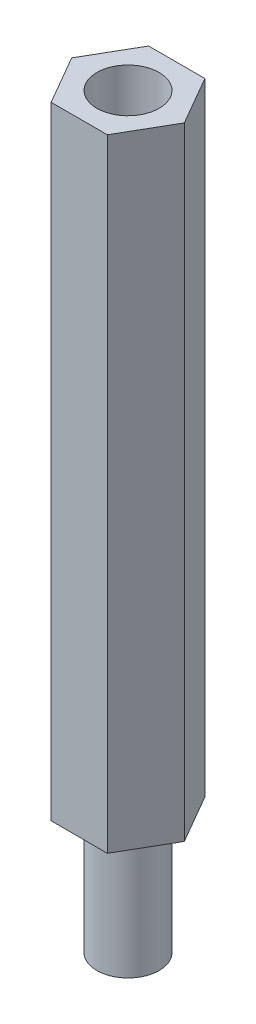
ISO-10303-21;
HEADER;
FILE_DESCRIPTION(('STEP AP214'),'2;1');
FILE_NAME('part.step','',(''),(''),'','','');
FILE_SCHEMA(('AUTOMOTIVE_DESIGN { 1 0 10303 214 1 1 1 1 }'));
ENDSEC;
DATA;
#1=APPLICATION_CONTEXT('core data for automotive mechanical design processes');
#2=APPLICATION_PROTOCOL_DEFINITION('international standard','automotive_design',2000,#1);
#3=PRODUCT_CONTEXT('',#1,'mechanical');
#4=PRODUCT('Part','Part','',(#3));
#5=PRODUCT_RELATED_PRODUCT_CATEGORY('part','',(#4));
#6=PRODUCT_DEFINITION_FORMATION('','',#4);
#7=PRODUCT_DEFINITION_CONTEXT('part definition',#1,'design');
#8=PRODUCT_DEFINITION('design','',#6,#7);
#9=PRODUCT_DEFINITION_SHAPE('','',#8);
#10=(LENGTH_UNIT() NAMED_UNIT(*) SI_UNIT(.MILLI.,.METRE.));
#11=(NAMED_UNIT(*) PLANE_ANGLE_UNIT() SI_UNIT($,.RADIAN.));
#12=(NAMED_UNIT(*) SI_UNIT($,.STERADIAN.) SOLID_ANGLE_UNIT());
#13=UNCERTAINTY_MEASURE_WITH_UNIT(LENGTH_MEASURE(1.E-05),#10,'distance_accuracy_value','');
#14=(GEOMETRIC_REPRESENTATION_CONTEXT(3) GLOBAL_UNCERTAINTY_ASSIGNED_CONTEXT((#13)) GLOBAL_UNIT_ASSIGNED_CONTEXT((#10,
#11,#12)) REPRESENTATION_CONTEXT('',''));
#15=CARTESIAN_POINT('',(0.,0.,0.));
#16=DIRECTION('',(0.,0.,1.));
#17=DIRECTION('',(1.,0.,0.));
#18=AXIS2_PLACEMENT_3D('',#15,#16,#17);
#19=CARTESIAN_POINT('',(-1.35677313259562,30.,2.35));
#20=DIRECTION('',(0.,0.,-1.));
#21=DIRECTION('',(-1.,0.,0.));
#22=AXIS2_PLACEMENT_3D('',#19,#20,#21);
#23=PLANE('',#22);
#24=DIRECTION('',(1.,0.,0.));
#25=VECTOR('',#24,1.);
#26=CARTESIAN_POINT('',(-1.35677313259562,0.,2.35));
#27=LINE('',#26,#25);
#28=CARTESIAN_POINT('',(-1.35677313259562,0.,2.35));
#29=VERTEX_POINT('',#28);
#30=CARTESIAN_POINT('',(1.35677313259562,0.,2.35));
#31=VERTEX_POINT('',#30);
#32=EDGE_CURVE('E122',#29,#31,#27,.T.);
#33=ORIENTED_EDGE('',*,*,#32,.T.);
#34=DIRECTION('',(0.,-1.,0.));
#35=VECTOR('',#34,1.);
#36=CARTESIAN_POINT('',(1.35677313259562,30.,2.35));
#37=LINE('',#36,#35);
#38=CARTESIAN_POINT('',(1.35677313259562,30.,2.35));
#39=VERTEX_POINT('',#38);
#40=EDGE_CURVE('E45',#39,#31,#37,.T.);
#41=ORIENTED_EDGE('',*,*,#40,.F.);
#42=DIRECTION('',(1.,0.,0.));
#43=VECTOR('',#42,1.);
#44=CARTESIAN_POINT('',(-1.35677313259562,30.,2.35));
#45=LINE('',#44,#43);
#46=CARTESIAN_POINT('',(-1.35677313259562,30.,2.35));
#47=VERTEX_POINT('',#46);
#48=EDGE_CURVE('E133',#47,#39,#45,.T.);
#49=ORIENTED_EDGE('',*,*,#48,.F.);
#50=DIRECTION('',(0.,-1.,0.));
#51=VECTOR('',#50,1.);
#52=CARTESIAN_POINT('',(-1.35677313259562,30.,2.35));
#53=LINE('',#52,#51);
#54=EDGE_CURVE('E118',#47,#29,#53,.T.);
#55=ORIENTED_EDGE('',*,*,#54,.T.);
#56=EDGE_LOOP('',(#33,#41,#49,#55));
#57=FACE_BOUND('',#56,.T.);
#58=ADVANCED_FACE('F37',(#57),#23,.F.);
#59=CARTESIAN_POINT('',(1.35677313259562,30.,2.35));
#60=DIRECTION('',(-0.866025403784439,0.,-0.5));
#61=DIRECTION('',(-0.5,0.,0.866025403784439));
#62=AXIS2_PLACEMENT_3D('',#59,#60,#61);
#63=PLANE('',#62);
#64=DIRECTION('',(0.5,0.,-0.866025403784439));
#65=VECTOR('',#64,1.);
#66=CARTESIAN_POINT('',(1.35677313259562,0.,2.35));
#67=LINE('',#66,#65);
#68=CARTESIAN_POINT('',(2.71354626519124,0.,0.));
#69=VERTEX_POINT('',#68);
#70=EDGE_CURVE('E125',#31,#69,#67,.T.);
#71=ORIENTED_EDGE('',*,*,#70,.T.);
#72=DIRECTION('',(0.,-1.,0.));
#73=VECTOR('',#72,1.);
#74=CARTESIAN_POINT('',(2.71354626519124,30.,0.));
#75=LINE('',#74,#73);
#76=CARTESIAN_POINT('',(2.71354626519124,30.,0.));
#77=VERTEX_POINT('',#76);
#78=EDGE_CURVE('E137',#77,#69,#75,.T.);
#79=ORIENTED_EDGE('',*,*,#78,.F.);
#80=DIRECTION('',(0.5,0.,-0.866025403784439));
#81=VECTOR('',#80,1.);
#82=CARTESIAN_POINT('',(1.35677313259562,30.,2.35));
#83=LINE('',#82,#81);
#84=EDGE_CURVE('E91',#39,#77,#83,.T.);
#85=ORIENTED_EDGE('',*,*,#84,.F.);
#86=ORIENTED_EDGE('',*,*,#40,.T.);
#87=EDGE_LOOP('',(#71,#79,#85,#86));
#88=FACE_BOUND('',#87,.T.);
#89=ADVANCED_FACE('F140',(#88),#63,.F.);
#90=CARTESIAN_POINT('',(2.71354626519124,30.,0.));
#91=DIRECTION('',(-0.866025403784439,0.,0.5));
#92=DIRECTION('',(0.5,0.,0.866025403784439));
#93=AXIS2_PLACEMENT_3D('',#90,#91,#92);
#94=PLANE('',#93);
#95=DIRECTION('',(-0.5,0.,-0.866025403784439));
#96=VECTOR('',#95,1.);
#97=CARTESIAN_POINT('',(2.71354626519124,0.,0.));
#98=LINE('',#97,#96);
#99=CARTESIAN_POINT('',(1.35677313259562,0.,-2.35));
#100=VERTEX_POINT('',#99);
#101=EDGE_CURVE('E128',#69,#100,#98,.T.);
#102=ORIENTED_EDGE('',*,*,#101,.T.);
#103=DIRECTION('',(0.,-1.,0.));
#104=VECTOR('',#103,1.);
#105=CARTESIAN_POINT('',(1.35677313259562,30.,-2.35));
#106=LINE('',#105,#104);
#107=CARTESIAN_POINT('',(1.35677313259562,30.,-2.35));
#108=VERTEX_POINT('',#107);
#109=EDGE_CURVE('E113',#108,#100,#106,.T.);
#110=ORIENTED_EDGE('',*,*,#109,.F.);
#111=DIRECTION('',(-0.5,0.,-0.866025403784439));
#112=VECTOR('',#111,1.);
#113=CARTESIAN_POINT('',(2.71354626519124,30.,0.));
#114=LINE('',#113,#112);
#115=EDGE_CURVE('E104',#77,#108,#114,.T.);
#116=ORIENTED_EDGE('',*,*,#115,.F.);
#117=ORIENTED_EDGE('',*,*,#78,.T.);
#118=EDGE_LOOP('',(#102,#110,#116,#117));
#119=FACE_BOUND('',#118,.T.);
#120=ADVANCED_FACE('F148',(#119),#94,.F.);
#121=CARTESIAN_POINT('',(1.35677313259562,30.,-2.35));
#122=DIRECTION('',(0.,0.,1.));
#123=DIRECTION('',(1.,0.,0.));
#124=AXIS2_PLACEMENT_3D('',#121,#122,#123);
#125=PLANE('',#124);
#126=DIRECTION('',(-1.,0.,0.));
#127=VECTOR('',#126,1.);
#128=CARTESIAN_POINT('',(1.35677313259562,0.,-2.35));
#129=LINE('',#128,#127);
#130=CARTESIAN_POINT('',(-1.35677313259562,0.,-2.35));
#131=VERTEX_POINT('',#130);
#132=EDGE_CURVE('E112',#100,#131,#129,.T.);
#133=ORIENTED_EDGE('',*,*,#132,.T.);
#134=DIRECTION('',(0.,-1.,0.));
#135=VECTOR('',#134,1.);
#136=CARTESIAN_POINT('',(-1.35677313259562,30.,-2.35));
#137=LINE('',#136,#135);
#138=CARTESIAN_POINT('',(-1.35677313259562,30.,-2.35));
#139=VERTEX_POINT('',#138);
#140=EDGE_CURVE('E109',#139,#131,#137,.T.);
#141=ORIENTED_EDGE('',*,*,#140,.F.);
#142=DIRECTION('',(-1.,0.,0.));
#143=VECTOR('',#142,1.);
#144=CARTESIAN_POINT('',(1.35677313259562,30.,-2.35));
#145=LINE('',#144,#143);
#146=EDGE_CURVE('E98',#108,#139,#145,.T.);
#147=ORIENTED_EDGE('',*,*,#146,.F.);
#148=ORIENTED_EDGE('',*,*,#109,.T.);
#149=EDGE_LOOP('',(#133,#141,#147,#148));
#150=FACE_BOUND('',#149,.T.);
#151=ADVANCED_FACE('F110',(#150),#125,.F.);
#152=CARTESIAN_POINT('',(-1.35677313259562,30.,-2.35));
#153=DIRECTION('',(0.866025403784439,0.,0.5));
#154=DIRECTION('',(0.5,0.,-0.866025403784439));
#155=AXIS2_PLACEMENT_3D('',#152,#153,#154);
#156=PLANE('',#155);
#157=DIRECTION('',(-0.5,0.,0.866025403784439));
#158=VECTOR('',#157,1.);
#159=CARTESIAN_POINT('',(-1.35677313259562,0.,-2.35));
#160=LINE('',#159,#158);
#161=CARTESIAN_POINT('',(-2.71354626519124,0.,0.));
#162=VERTEX_POINT('',#161);
#163=EDGE_CURVE('E76',#131,#162,#160,.T.);
#164=ORIENTED_EDGE('',*,*,#163,.T.);
#165=DIRECTION('',(0.,-1.,0.));
#166=VECTOR('',#165,1.);
#167=CARTESIAN_POINT('',(-2.71354626519124,30.,0.));
#168=LINE('',#167,#166);
#169=CARTESIAN_POINT('',(-2.71354626519124,30.,0.));
#170=VERTEX_POINT('',#169);
#171=EDGE_CURVE('E114',#170,#162,#168,.T.);
#172=ORIENTED_EDGE('',*,*,#171,.F.);
#173=DIRECTION('',(-0.5,0.,0.866025403784439));
#174=VECTOR('',#173,1.);
#175=CARTESIAN_POINT('',(-1.35677313259562,30.,-2.35));
#176=LINE('',#175,#174);
#177=EDGE_CURVE('E102',#139,#170,#176,.T.);
#178=ORIENTED_EDGE('',*,*,#177,.F.);
#179=ORIENTED_EDGE('',*,*,#140,.T.);
#180=EDGE_LOOP('',(#164,#172,#178,#179));
#181=FACE_BOUND('',#180,.T.);
#182=ADVANCED_FACE('F116',(#181),#156,.F.);
#183=CARTESIAN_POINT('',(-2.71354626519124,30.,0.));
#184=DIRECTION('',(0.866025403784439,0.,-0.5));
#185=DIRECTION('',(-0.5,0.,-0.866025403784439));
#186=AXIS2_PLACEMENT_3D('',#183,#184,#185);
#187=PLANE('',#186);
#188=DIRECTION('',(0.5,0.,0.866025403784439));
#189=VECTOR('',#188,1.);
#190=CARTESIAN_POINT('',(-2.71354626519124,0.,0.));
#191=LINE('',#190,#189);
#192=EDGE_CURVE('E82',#162,#29,#191,.T.);
#193=ORIENTED_EDGE('',*,*,#192,.T.);
#194=ORIENTED_EDGE('',*,*,#54,.F.);
#195=DIRECTION('',(0.5,0.,0.866025403784439));
#196=VECTOR('',#195,1.);
#197=CARTESIAN_POINT('',(-2.71354626519124,30.,0.));
#198=LINE('',#197,#196);
#199=EDGE_CURVE('E53',#170,#47,#198,.T.);
#200=ORIENTED_EDGE('',*,*,#199,.F.);
#201=ORIENTED_EDGE('',*,*,#171,.T.);
#202=EDGE_LOOP('',(#193,#194,#200,#201));
#203=FACE_BOUND('',#202,.T.);
#204=ADVANCED_FACE('F164',(#203),#187,.F.);
#205=CARTESIAN_POINT('',(0.,30.,0.));
#206=DIRECTION('',(0.,1.,0.));
#207=DIRECTION('',(0.,0.,1.));
#208=AXIS2_PLACEMENT_3D('',#205,#206,#207);
#209=PLANE('',#208);
#210=CARTESIAN_POINT('',(0.,30.,0.));
#211=DIRECTION('',(0.,1.,0.));
#212=DIRECTION('',(0.,0.,1.));
#213=AXIS2_PLACEMENT_3D('',#210,#211,#212);
#214=CIRCLE('',#213,1.5);
#215=CARTESIAN_POINT('',(0.,30.,1.5));
#216=VERTEX_POINT('',#215);
#217=EDGE_CURVE('E157',#216,#216,#214,.T.);
#218=ORIENTED_EDGE('',*,*,#217,.F.);
#219=EDGE_LOOP('',(#218));
#220=FACE_BOUND('',#219,.T.);
#221=ORIENTED_EDGE('',*,*,#48,.T.);
#222=ORIENTED_EDGE('',*,*,#84,.T.);
#223=ORIENTED_EDGE('',*,*,#115,.T.);
#224=ORIENTED_EDGE('',*,*,#146,.T.);
#225=ORIENTED_EDGE('',*,*,#177,.T.);
#226=ORIENTED_EDGE('',*,*,#199,.T.);
#227=EDGE_LOOP('',(#221,#222,#223,#224,#225,#226));
#228=FACE_BOUND('',#227,.T.);
#229=ADVANCED_FACE('F100',(#220,#228),#209,.T.);
#230=CARTESIAN_POINT('',(0.,0.,0.));
#231=DIRECTION('',(0.,1.,0.));
#232=DIRECTION('',(0.,0.,1.));
#233=AXIS2_PLACEMENT_3D('',#230,#231,#232);
#234=PLANE('',#233);
#235=CARTESIAN_POINT('',(0.,0.,0.));
#236=DIRECTION('',(0.,1.,0.));
#237=DIRECTION('',(0.,0.,1.));
#238=AXIS2_PLACEMENT_3D('',#235,#236,#237);
#239=CIRCLE('',#238,1.5);
#240=CARTESIAN_POINT('',(0.,0.,1.5));
#241=VERTEX_POINT('',#240);
#242=EDGE_CURVE('E12',#241,#241,#239,.F.);
#243=ORIENTED_EDGE('',*,*,#242,.F.);
#244=EDGE_LOOP('',(#243));
#245=FACE_BOUND('',#244,.T.);
#246=ORIENTED_EDGE('',*,*,#32,.F.);
#247=ORIENTED_EDGE('',*,*,#192,.F.);
#248=ORIENTED_EDGE('',*,*,#163,.F.);
#249=ORIENTED_EDGE('',*,*,#132,.F.);
#250=ORIENTED_EDGE('',*,*,#101,.F.);
#251=ORIENTED_EDGE('',*,*,#70,.F.);
#252=EDGE_LOOP('',(#246,#247,#248,#249,#250,#251));
#253=FACE_BOUND('',#252,.T.);
#254=ADVANCED_FACE('F145',(#245,#253),#234,.F.);
#255=CARTESIAN_POINT('',(0.,-6.,0.));
#256=DIRECTION('',(0.,1.,0.));
#257=DIRECTION('',(0.,0.,1.));
#258=AXIS2_PLACEMENT_3D('',#255,#256,#257);
#259=CYLINDRICAL_SURFACE('',#258,1.5);
#260=CARTESIAN_POINT('',(0.,-6.,0.));
#261=DIRECTION('',(0.,-1.,0.));
#262=DIRECTION('',(0.,0.,-1.));
#263=AXIS2_PLACEMENT_3D('',#260,#261,#262);
#264=CIRCLE('',#263,1.5);
#265=CARTESIAN_POINT('',(0.,-6.,-1.5));
#266=VERTEX_POINT('',#265);
#267=EDGE_CURVE('E126',#266,#266,#264,.T.);
#268=ORIENTED_EDGE('',*,*,#267,.F.);
#269=EDGE_LOOP('',(#268));
#270=FACE_BOUND('',#269,.T.);
#271=ORIENTED_EDGE('',*,*,#242,.T.);
#272=EDGE_LOOP('',(#271));
#273=FACE_BOUND('',#272,.T.);
#274=ADVANCED_FACE('F170',(#270,#273),#259,.T.);
#275=CARTESIAN_POINT('',(0.,-6.,0.));
#276=DIRECTION('',(0.,-1.,0.));
#277=DIRECTION('',(0.,0.,-1.));
#278=AXIS2_PLACEMENT_3D('',#275,#276,#277);
#279=PLANE('',#278);
#280=ORIENTED_EDGE('',*,*,#267,.T.);
#281=EDGE_LOOP('',(#280));
#282=FACE_BOUND('',#281,.T.);
#283=ADVANCED_FACE('F211',(#282),#279,.T.);
#284=CARTESIAN_POINT('',(0.,-4.24264068711928,0.));
#285=DIRECTION('',(0.,1.,0.));
#286=DIRECTION('',(0.,0.,1.));
#287=AXIS2_PLACEMENT_3D('',#284,#285,#286);
#288=CYLINDRICAL_SURFACE('',#287,1.5);
#289=CARTESIAN_POINT('',(0.,6.,0.));
#290=DIRECTION('',(0.,1.,0.));
#291=DIRECTION('',(0.,0.,1.));
#292=AXIS2_PLACEMENT_3D('',#289,#290,#291);
#293=CIRCLE('',#292,1.5);
#294=CARTESIAN_POINT('',(0.,6.,1.5));
#295=VERTEX_POINT('',#294);
#296=EDGE_CURVE('E154',#295,#295,#293,.F.);
#297=ORIENTED_EDGE('',*,*,#296,.T.);
#298=EDGE_LOOP('',(#297));
#299=FACE_BOUND('',#298,.T.);
#300=ORIENTED_EDGE('',*,*,#217,.T.);
#301=EDGE_LOOP('',(#300));
#302=FACE_BOUND('',#301,.T.);
#303=ADVANCED_FACE('F161',(#299,#302),#288,.F.);
#304=CARTESIAN_POINT('',(0.,6.,0.));
#305=DIRECTION('',(0.,1.,0.));
#306=DIRECTION('',(0.,0.,1.));
#307=AXIS2_PLACEMENT_3D('',#304,#305,#306);
#308=PLANE('',#307);
#309=ORIENTED_EDGE('',*,*,#296,.F.);
#310=EDGE_LOOP('',(#309));
#311=FACE_BOUND('',#310,.T.);
#312=ADVANCED_FACE('F232',(#311),#308,.T.);
#313=CLOSED_SHELL('',(#58,#89,#120,#151,#182,#204,#229,#254,#274,#283,#303,#312));
#314=MANIFOLD_SOLID_BREP('B2',#313);
#315=ADVANCED_BREP_SHAPE_REPRESENTATION('',(#18,#314),#14);
#316=SHAPE_DEFINITION_REPRESENTATION(#9,#315);
ENDSEC;
END-ISO-10303-21;
